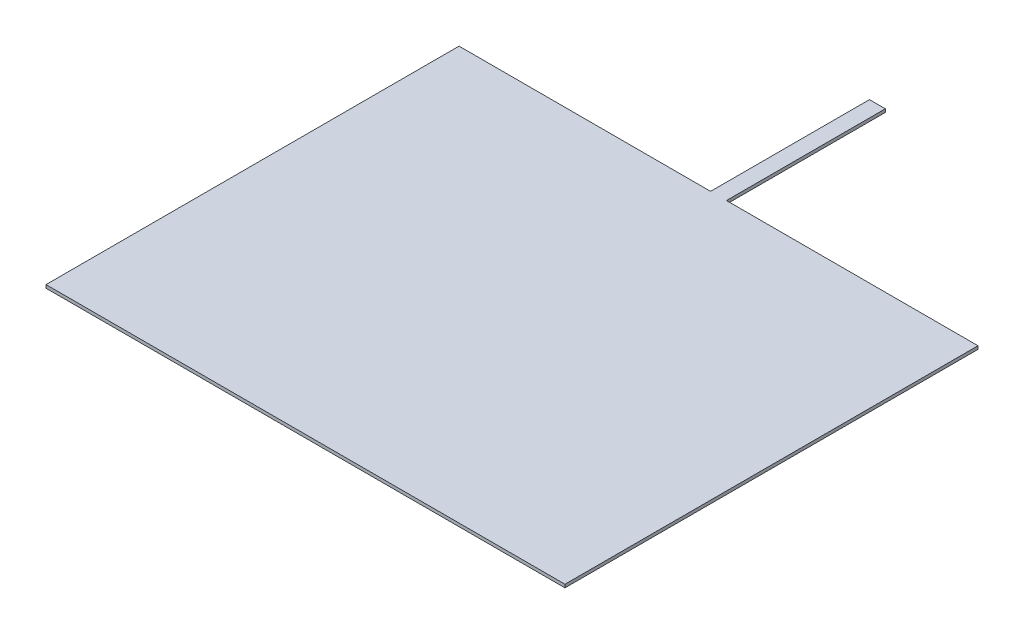
ISO-10303-21;
HEADER;
FILE_DESCRIPTION(('STEP AP214'),'2;1');
FILE_NAME('part.step','',(''),(''),'','','');
FILE_SCHEMA(('AUTOMOTIVE_DESIGN { 1 0 10303 214 1 1 1 1 }'));
ENDSEC;
DATA;
#1=APPLICATION_CONTEXT('core data for automotive mechanical design processes');
#2=APPLICATION_PROTOCOL_DEFINITION('international standard','automotive_design',2000,#1);
#3=PRODUCT_CONTEXT('',#1,'mechanical');
#4=PRODUCT('Part','Part','',(#3));
#5=PRODUCT_RELATED_PRODUCT_CATEGORY('part','',(#4));
#6=PRODUCT_DEFINITION_FORMATION('','',#4);
#7=PRODUCT_DEFINITION_CONTEXT('part definition',#1,'design');
#8=PRODUCT_DEFINITION('design','',#6,#7);
#9=PRODUCT_DEFINITION_SHAPE('','',#8);
#10=(LENGTH_UNIT() NAMED_UNIT(*) SI_UNIT(.MILLI.,.METRE.));
#11=(NAMED_UNIT(*) PLANE_ANGLE_UNIT() SI_UNIT($,.RADIAN.));
#12=(NAMED_UNIT(*) SI_UNIT($,.STERADIAN.) SOLID_ANGLE_UNIT());
#13=UNCERTAINTY_MEASURE_WITH_UNIT(LENGTH_MEASURE(1.E-05),#10,'distance_accuracy_value','');
#14=(GEOMETRIC_REPRESENTATION_CONTEXT(3) GLOBAL_UNCERTAINTY_ASSIGNED_CONTEXT((#13)) GLOBAL_UNIT_ASSIGNED_CONTEXT((#10,
#11,#12)) REPRESENTATION_CONTEXT('',''));
#15=CARTESIAN_POINT('',(0.,0.,0.));
#16=DIRECTION('',(0.,0.,1.));
#17=DIRECTION('',(1.,0.,0.));
#18=AXIS2_PLACEMENT_3D('',#15,#16,#17);
#19=CARTESIAN_POINT('',(0.,0.6,-78.));
#20=DIRECTION('',(0.,0.,-1.));
#21=DIRECTION('',(-1.,0.,0.));
#22=AXIS2_PLACEMENT_3D('',#19,#20,#21);
#23=PLANE('',#22);
#24=DIRECTION('',(1.,0.,0.));
#25=VECTOR('',#24,1.);
#26=CARTESIAN_POINT('',(0.,0.,-78.));
#27=LINE('',#26,#25);
#28=CARTESIAN_POINT('',(50.5,0.,-78.));
#29=VERTEX_POINT('',#28);
#30=CARTESIAN_POINT('',(98.,0.,-78.));
#31=VERTEX_POINT('',#30);
#32=EDGE_CURVE('E149',#29,#31,#27,.T.);
#33=ORIENTED_EDGE('',*,*,#32,.F.);
#34=DIRECTION('',(0.,-1.,0.));
#35=VECTOR('',#34,1.);
#36=CARTESIAN_POINT('',(50.5,0.6,-78.));
#37=LINE('',#36,#35);
#38=CARTESIAN_POINT('',(50.5,0.6,-78.));
#39=VERTEX_POINT('',#38);
#40=EDGE_CURVE('E11',#39,#29,#37,.T.);
#41=ORIENTED_EDGE('',*,*,#40,.F.);
#42=DIRECTION('',(1.,0.,0.));
#43=VECTOR('',#42,1.);
#44=CARTESIAN_POINT('',(0.,0.6,-78.));
#45=LINE('',#44,#43);
#46=CARTESIAN_POINT('',(98.,0.6,-78.));
#47=VERTEX_POINT('',#46);
#48=EDGE_CURVE('E143',#39,#47,#45,.T.);
#49=ORIENTED_EDGE('',*,*,#48,.T.);
#50=DIRECTION('',(0.,-1.,0.));
#51=VECTOR('',#50,1.);
#52=CARTESIAN_POINT('',(98.,0.6,-78.));
#53=LINE('',#52,#51);
#54=EDGE_CURVE('E97',#47,#31,#53,.T.);
#55=ORIENTED_EDGE('',*,*,#54,.T.);
#56=EDGE_LOOP('',(#33,#41,#49,#55));
#57=FACE_BOUND('',#56,.T.);
#58=ADVANCED_FACE('F45',(#57),#23,.T.);
#59=CARTESIAN_POINT('',(50.5,0.6,0.));
#60=DIRECTION('',(-1.,0.,0.));
#61=DIRECTION('',(0.,0.,1.));
#62=AXIS2_PLACEMENT_3D('',#59,#60,#61);
#63=PLANE('',#62);
#64=DIRECTION('',(0.,0.,-1.));
#65=VECTOR('',#64,1.);
#66=CARTESIAN_POINT('',(50.5,0.,0.));
#67=LINE('',#66,#65);
#68=CARTESIAN_POINT('',(50.5,0.,-108.));
#69=VERTEX_POINT('',#68);
#70=EDGE_CURVE('E153',#29,#69,#67,.T.);
#71=ORIENTED_EDGE('',*,*,#70,.T.);
#72=DIRECTION('',(0.,-1.,0.));
#73=VECTOR('',#72,1.);
#74=CARTESIAN_POINT('',(50.5,0.6,-108.));
#75=LINE('',#74,#73);
#76=CARTESIAN_POINT('',(50.5,0.6,-108.));
#77=VERTEX_POINT('',#76);
#78=EDGE_CURVE('E55',#77,#69,#75,.T.);
#79=ORIENTED_EDGE('',*,*,#78,.F.);
#80=DIRECTION('',(0.,0.,-1.));
#81=VECTOR('',#80,1.);
#82=CARTESIAN_POINT('',(50.5,0.6,0.));
#83=LINE('',#82,#81);
#84=EDGE_CURVE('E202',#39,#77,#83,.T.);
#85=ORIENTED_EDGE('',*,*,#84,.F.);
#86=ORIENTED_EDGE('',*,*,#40,.T.);
#87=EDGE_LOOP('',(#71,#79,#85,#86));
#88=FACE_BOUND('',#87,.T.);
#89=ADVANCED_FACE('F47',(#88),#63,.F.);
#90=CARTESIAN_POINT('',(0.,0.6,-108.));
#91=DIRECTION('',(0.,0.,-1.));
#92=DIRECTION('',(-1.,0.,0.));
#93=AXIS2_PLACEMENT_3D('',#90,#91,#92);
#94=PLANE('',#93);
#95=DIRECTION('',(1.,0.,0.));
#96=VECTOR('',#95,1.);
#97=CARTESIAN_POINT('',(0.,0.,-108.));
#98=LINE('',#97,#96);
#99=CARTESIAN_POINT('',(47.5,0.,-108.));
#100=VERTEX_POINT('',#99);
#101=EDGE_CURVE('E158',#100,#69,#98,.T.);
#102=ORIENTED_EDGE('',*,*,#101,.F.);
#103=DIRECTION('',(0.,-1.,0.));
#104=VECTOR('',#103,1.);
#105=CARTESIAN_POINT('',(47.5,0.6,-108.));
#106=LINE('',#105,#104);
#107=CARTESIAN_POINT('',(47.5,0.6,-108.));
#108=VERTEX_POINT('',#107);
#109=EDGE_CURVE('E182',#108,#100,#106,.T.);
#110=ORIENTED_EDGE('',*,*,#109,.F.);
#111=DIRECTION('',(1.,0.,0.));
#112=VECTOR('',#111,1.);
#113=CARTESIAN_POINT('',(0.,0.6,-108.));
#114=LINE('',#113,#112);
#115=EDGE_CURVE('E191',#108,#77,#114,.T.);
#116=ORIENTED_EDGE('',*,*,#115,.T.);
#117=ORIENTED_EDGE('',*,*,#78,.T.);
#118=EDGE_LOOP('',(#102,#110,#116,#117));
#119=FACE_BOUND('',#118,.T.);
#120=ADVANCED_FACE('F189',(#119),#94,.T.);
#121=CARTESIAN_POINT('',(47.5,0.6,0.));
#122=DIRECTION('',(-1.,0.,0.));
#123=DIRECTION('',(0.,0.,1.));
#124=AXIS2_PLACEMENT_3D('',#121,#122,#123);
#125=PLANE('',#124);
#126=DIRECTION('',(0.,0.,-1.));
#127=VECTOR('',#126,1.);
#128=CARTESIAN_POINT('',(47.5,0.,0.));
#129=LINE('',#128,#127);
#130=CARTESIAN_POINT('',(47.5,0.,-78.));
#131=VERTEX_POINT('',#130);
#132=EDGE_CURVE('E162',#131,#100,#129,.T.);
#133=ORIENTED_EDGE('',*,*,#132,.F.);
#134=DIRECTION('',(0.,-1.,0.));
#135=VECTOR('',#134,1.);
#136=CARTESIAN_POINT('',(47.5,0.6,-78.));
#137=LINE('',#136,#135);
#138=CARTESIAN_POINT('',(47.5,0.6,-78.));
#139=VERTEX_POINT('',#138);
#140=EDGE_CURVE('E179',#139,#131,#137,.T.);
#141=ORIENTED_EDGE('',*,*,#140,.F.);
#142=DIRECTION('',(0.,0.,-1.));
#143=VECTOR('',#142,1.);
#144=CARTESIAN_POINT('',(47.5,0.6,0.));
#145=LINE('',#144,#143);
#146=EDGE_CURVE('E141',#139,#108,#145,.T.);
#147=ORIENTED_EDGE('',*,*,#146,.T.);
#148=ORIENTED_EDGE('',*,*,#109,.T.);
#149=EDGE_LOOP('',(#133,#141,#147,#148));
#150=FACE_BOUND('',#149,.T.);
#151=ADVANCED_FACE('F200',(#150),#125,.T.);
#152=CARTESIAN_POINT('',(0.,0.,-78.));
#153=VERTEX_POINT('',#152);
#154=EDGE_CURVE('E154',#153,#131,#27,.T.);
#155=ORIENTED_EDGE('',*,*,#154,.F.);
#156=DIRECTION('',(0.,-1.,0.));
#157=VECTOR('',#156,1.);
#158=CARTESIAN_POINT('',(0.,0.6,-78.));
#159=LINE('',#158,#157);
#160=CARTESIAN_POINT('',(0.,0.6,-78.));
#161=VERTEX_POINT('',#160);
#162=EDGE_CURVE('E126',#161,#153,#159,.T.);
#163=ORIENTED_EDGE('',*,*,#162,.F.);
#164=EDGE_CURVE('E137',#161,#139,#45,.T.);
#165=ORIENTED_EDGE('',*,*,#164,.T.);
#166=ORIENTED_EDGE('',*,*,#140,.T.);
#167=EDGE_LOOP('',(#155,#163,#165,#166));
#168=FACE_BOUND('',#167,.T.);
#169=ADVANCED_FACE('F210',(#168),#23,.T.);
#170=CARTESIAN_POINT('',(0.,0.6,0.));
#171=DIRECTION('',(-1.,0.,0.));
#172=DIRECTION('',(0.,0.,1.));
#173=AXIS2_PLACEMENT_3D('',#170,#171,#172);
#174=PLANE('',#173);
#175=DIRECTION('',(0.,0.,-1.));
#176=VECTOR('',#175,1.);
#177=CARTESIAN_POINT('',(0.,0.,0.));
#178=LINE('',#177,#176);
#179=CARTESIAN_POINT('',(0.,0.,0.));
#180=VERTEX_POINT('',#179);
#181=EDGE_CURVE('E124',#180,#153,#178,.T.);
#182=ORIENTED_EDGE('',*,*,#181,.F.);
#183=DIRECTION('',(0.,-1.,0.));
#184=VECTOR('',#183,1.);
#185=CARTESIAN_POINT('',(0.,0.6,0.));
#186=LINE('',#185,#184);
#187=CARTESIAN_POINT('',(0.,0.6,0.));
#188=VERTEX_POINT('',#187);
#189=EDGE_CURVE('E118',#188,#180,#186,.T.);
#190=ORIENTED_EDGE('',*,*,#189,.F.);
#191=DIRECTION('',(0.,0.,-1.));
#192=VECTOR('',#191,1.);
#193=CARTESIAN_POINT('',(0.,0.6,0.));
#194=LINE('',#193,#192);
#195=EDGE_CURVE('E122',#188,#161,#194,.T.);
#196=ORIENTED_EDGE('',*,*,#195,.T.);
#197=ORIENTED_EDGE('',*,*,#162,.T.);
#198=EDGE_LOOP('',(#182,#190,#196,#197));
#199=FACE_BOUND('',#198,.T.);
#200=ADVANCED_FACE('F120',(#199),#174,.T.);
#201=CARTESIAN_POINT('',(0.,0.6,0.));
#202=DIRECTION('',(0.,0.,-1.));
#203=DIRECTION('',(-1.,0.,0.));
#204=AXIS2_PLACEMENT_3D('',#201,#202,#203);
#205=PLANE('',#204);
#206=DIRECTION('',(1.,0.,0.));
#207=VECTOR('',#206,1.);
#208=CARTESIAN_POINT('',(0.,0.,0.));
#209=LINE('',#208,#207);
#210=CARTESIAN_POINT('',(98.,0.,0.));
#211=VERTEX_POINT('',#210);
#212=EDGE_CURVE('E90',#180,#211,#209,.T.);
#213=ORIENTED_EDGE('',*,*,#212,.T.);
#214=DIRECTION('',(0.,-1.,0.));
#215=VECTOR('',#214,1.);
#216=CARTESIAN_POINT('',(98.,0.6,0.));
#217=LINE('',#216,#215);
#218=CARTESIAN_POINT('',(98.,0.6,0.));
#219=VERTEX_POINT('',#218);
#220=EDGE_CURVE('E127',#219,#211,#217,.T.);
#221=ORIENTED_EDGE('',*,*,#220,.F.);
#222=DIRECTION('',(1.,0.,0.));
#223=VECTOR('',#222,1.);
#224=CARTESIAN_POINT('',(0.,0.6,0.));
#225=LINE('',#224,#223);
#226=EDGE_CURVE('E129',#188,#219,#225,.T.);
#227=ORIENTED_EDGE('',*,*,#226,.F.);
#228=ORIENTED_EDGE('',*,*,#189,.T.);
#229=EDGE_LOOP('',(#213,#221,#227,#228));
#230=FACE_BOUND('',#229,.T.);
#231=ADVANCED_FACE('F130',(#230),#205,.F.);
#232=CARTESIAN_POINT('',(98.,0.6,0.));
#233=DIRECTION('',(-1.,0.,0.));
#234=DIRECTION('',(0.,0.,1.));
#235=AXIS2_PLACEMENT_3D('',#232,#233,#234);
#236=PLANE('',#235);
#237=DIRECTION('',(0.,0.,-1.));
#238=VECTOR('',#237,1.);
#239=CARTESIAN_POINT('',(98.,0.,0.));
#240=LINE('',#239,#238);
#241=EDGE_CURVE('E170',#211,#31,#240,.T.);
#242=ORIENTED_EDGE('',*,*,#241,.T.);
#243=ORIENTED_EDGE('',*,*,#54,.F.);
#244=DIRECTION('',(0.,0.,-1.));
#245=VECTOR('',#244,1.);
#246=CARTESIAN_POINT('',(98.,0.6,0.));
#247=LINE('',#246,#245);
#248=EDGE_CURVE('E63',#219,#47,#247,.T.);
#249=ORIENTED_EDGE('',*,*,#248,.F.);
#250=ORIENTED_EDGE('',*,*,#220,.T.);
#251=EDGE_LOOP('',(#242,#243,#249,#250));
#252=FACE_BOUND('',#251,.T.);
#253=ADVANCED_FACE('F225',(#252),#236,.F.);
#254=CARTESIAN_POINT('',(0.,0.6,0.));
#255=DIRECTION('',(0.,1.,0.));
#256=DIRECTION('',(0.,0.,1.));
#257=AXIS2_PLACEMENT_3D('',#254,#255,#256);
#258=PLANE('',#257);
#259=ORIENTED_EDGE('',*,*,#48,.F.);
#260=ORIENTED_EDGE('',*,*,#84,.T.);
#261=ORIENTED_EDGE('',*,*,#115,.F.);
#262=ORIENTED_EDGE('',*,*,#146,.F.);
#263=ORIENTED_EDGE('',*,*,#164,.F.);
#264=ORIENTED_EDGE('',*,*,#195,.F.);
#265=ORIENTED_EDGE('',*,*,#226,.T.);
#266=ORIENTED_EDGE('',*,*,#248,.T.);
#267=EDGE_LOOP('',(#259,#260,#261,#262,#263,#264,#265,#266));
#268=FACE_BOUND('',#267,.T.);
#269=ADVANCED_FACE('F134',(#268),#258,.T.);
#270=CARTESIAN_POINT('',(0.,0.,0.));
#271=DIRECTION('',(0.,1.,0.));
#272=DIRECTION('',(0.,0.,1.));
#273=AXIS2_PLACEMENT_3D('',#270,#271,#272);
#274=PLANE('',#273);
#275=ORIENTED_EDGE('',*,*,#32,.T.);
#276=ORIENTED_EDGE('',*,*,#241,.F.);
#277=ORIENTED_EDGE('',*,*,#212,.F.);
#278=ORIENTED_EDGE('',*,*,#181,.T.);
#279=ORIENTED_EDGE('',*,*,#154,.T.);
#280=ORIENTED_EDGE('',*,*,#132,.T.);
#281=ORIENTED_EDGE('',*,*,#101,.T.);
#282=ORIENTED_EDGE('',*,*,#70,.F.);
#283=EDGE_LOOP('',(#275,#276,#277,#278,#279,#280,#281,#282));
#284=FACE_BOUND('',#283,.T.);
#285=ADVANCED_FACE('F195',(#284),#274,.F.);
#286=CLOSED_SHELL('',(#58,#89,#120,#151,#169,#200,#231,#253,#269,#285));
#287=MANIFOLD_SOLID_BREP('B2',#286);
#288=ADVANCED_BREP_SHAPE_REPRESENTATION('',(#18,#287),#14);
#289=SHAPE_DEFINITION_REPRESENTATION(#9,#288);
ENDSEC;
END-ISO-10303-21;
